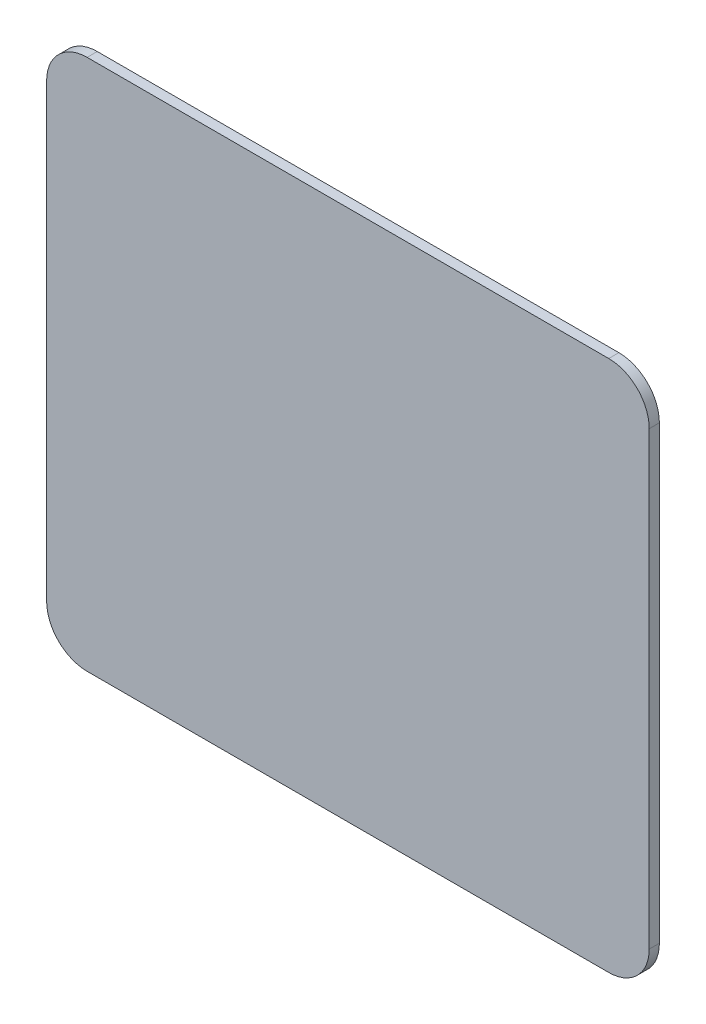
ISO-10303-21;
HEADER;
FILE_DESCRIPTION(('STEP AP214'),'2;1');
FILE_NAME('part.step','',(''),(''),'','','');
FILE_SCHEMA(('AUTOMOTIVE_DESIGN { 1 0 10303 214 1 1 1 1 }'));
ENDSEC;
DATA;
#1=APPLICATION_CONTEXT('core data for automotive mechanical design processes');
#2=APPLICATION_PROTOCOL_DEFINITION('international standard','automotive_design',2000,#1);
#3=PRODUCT_CONTEXT('',#1,'mechanical');
#4=PRODUCT('Part','Part','',(#3));
#5=PRODUCT_RELATED_PRODUCT_CATEGORY('part','',(#4));
#6=PRODUCT_DEFINITION_FORMATION('','',#4);
#7=PRODUCT_DEFINITION_CONTEXT('part definition',#1,'design');
#8=PRODUCT_DEFINITION('design','',#6,#7);
#9=PRODUCT_DEFINITION_SHAPE('','',#8);
#10=(LENGTH_UNIT() NAMED_UNIT(*) SI_UNIT(.MILLI.,.METRE.));
#11=(NAMED_UNIT(*) PLANE_ANGLE_UNIT() SI_UNIT($,.RADIAN.));
#12=(NAMED_UNIT(*) SI_UNIT($,.STERADIAN.) SOLID_ANGLE_UNIT());
#13=UNCERTAINTY_MEASURE_WITH_UNIT(LENGTH_MEASURE(1.E-05),#10,'distance_accuracy_value','');
#14=(GEOMETRIC_REPRESENTATION_CONTEXT(3) GLOBAL_UNCERTAINTY_ASSIGNED_CONTEXT((#13)) GLOBAL_UNIT_ASSIGNED_CONTEXT((#10,
#11,#12)) REPRESENTATION_CONTEXT('',''));
#15=CARTESIAN_POINT('',(0.,0.,0.));
#16=DIRECTION('',(0.,0.,1.));
#17=DIRECTION('',(1.,0.,0.));
#18=AXIS2_PLACEMENT_3D('',#15,#16,#17);
#19=CARTESIAN_POINT('',(0.,0.,6.35));
#20=DIRECTION('',(1.,0.,0.));
#21=DIRECTION('',(0.,0.,-1.));
#22=AXIS2_PLACEMENT_3D('',#19,#20,#21);
#23=PLANE('',#22);
#24=DIRECTION('',(0.,-1.,0.));
#25=VECTOR('',#24,1.);
#26=CARTESIAN_POINT('',(0.,0.,6.35));
#27=LINE('',#26,#25);
#28=CARTESIAN_POINT('',(0.,-25.4,6.35));
#29=VERTEX_POINT('',#28);
#30=CARTESIAN_POINT('',(0.,-308.102,6.35));
#31=VERTEX_POINT('',#30);
#32=EDGE_CURVE('E113',#29,#31,#27,.T.);
#33=ORIENTED_EDGE('',*,*,#32,.F.);
#34=DIRECTION('',(0.,0.,-1.));
#35=VECTOR('',#34,1.);
#36=CARTESIAN_POINT('',(0.,-25.4,6.35));
#37=LINE('',#36,#35);
#38=CARTESIAN_POINT('',(0.,-25.4,0.));
#39=VERTEX_POINT('',#38);
#40=EDGE_CURVE('E147',#29,#39,#37,.T.);
#41=ORIENTED_EDGE('',*,*,#40,.T.);
#42=DIRECTION('',(0.,-1.,0.));
#43=VECTOR('',#42,1.);
#44=CARTESIAN_POINT('',(0.,0.,0.));
#45=LINE('',#44,#43);
#46=CARTESIAN_POINT('',(0.,-308.102,0.));
#47=VERTEX_POINT('',#46);
#48=EDGE_CURVE('E153',#39,#47,#45,.T.);
#49=ORIENTED_EDGE('',*,*,#48,.T.);
#50=DIRECTION('',(0.,0.,-1.));
#51=VECTOR('',#50,1.);
#52=CARTESIAN_POINT('',(0.,-308.102,6.35));
#53=LINE('',#52,#51);
#54=EDGE_CURVE('E142',#47,#31,#53,.F.);
#55=ORIENTED_EDGE('',*,*,#54,.T.);
#56=EDGE_LOOP('',(#33,#41,#49,#55));
#57=FACE_BOUND('',#56,.T.);
#58=ADVANCED_FACE('F33',(#57),#23,.F.);
#59=CARTESIAN_POINT('',(0.,-333.502,6.35));
#60=DIRECTION('',(0.,1.,0.));
#61=DIRECTION('',(0.,0.,1.));
#62=AXIS2_PLACEMENT_3D('',#59,#60,#61);
#63=PLANE('',#62);
#64=DIRECTION('',(1.,0.,0.));
#65=VECTOR('',#64,1.);
#66=CARTESIAN_POINT('',(0.,-333.502,6.35));
#67=LINE('',#66,#65);
#68=CARTESIAN_POINT('',(25.4,-333.502,6.35));
#69=VERTEX_POINT('',#68);
#70=CARTESIAN_POINT('',(352.552,-333.502,6.35));
#71=VERTEX_POINT('',#70);
#72=EDGE_CURVE('E116',#69,#71,#67,.T.);
#73=ORIENTED_EDGE('',*,*,#72,.F.);
#74=DIRECTION('',(0.,0.,-1.));
#75=VECTOR('',#74,1.);
#76=CARTESIAN_POINT('',(25.4,-333.502,6.35));
#77=LINE('',#76,#75);
#78=CARTESIAN_POINT('',(25.4,-333.502,0.));
#79=VERTEX_POINT('',#78);
#80=EDGE_CURVE('E136',#69,#79,#77,.T.);
#81=ORIENTED_EDGE('',*,*,#80,.T.);
#82=DIRECTION('',(1.,0.,0.));
#83=VECTOR('',#82,1.);
#84=CARTESIAN_POINT('',(0.,-333.502,0.));
#85=LINE('',#84,#83);
#86=CARTESIAN_POINT('',(352.552,-333.502,0.));
#87=VERTEX_POINT('',#86);
#88=EDGE_CURVE('E118',#79,#87,#85,.T.);
#89=ORIENTED_EDGE('',*,*,#88,.T.);
#90=DIRECTION('',(0.,0.,-1.));
#91=VECTOR('',#90,1.);
#92=CARTESIAN_POINT('',(352.552,-333.502,6.35));
#93=LINE('',#92,#91);
#94=EDGE_CURVE('E131',#87,#71,#93,.F.);
#95=ORIENTED_EDGE('',*,*,#94,.T.);
#96=EDGE_LOOP('',(#73,#81,#89,#95));
#97=FACE_BOUND('',#96,.T.);
#98=ADVANCED_FACE('F172',(#97),#63,.F.);
#99=CARTESIAN_POINT('',(377.952,0.,6.35));
#100=DIRECTION('',(-1.,0.,0.));
#101=DIRECTION('',(0.,-1.,0.));
#102=AXIS2_PLACEMENT_3D('',#99,#100,#101);
#103=PLANE('',#102);
#104=DIRECTION('',(0.,1.,0.));
#105=VECTOR('',#104,1.);
#106=CARTESIAN_POINT('',(377.952,0.,6.35));
#107=LINE('',#106,#105);
#108=CARTESIAN_POINT('',(377.952,-308.102,6.35));
#109=VERTEX_POINT('',#108);
#110=CARTESIAN_POINT('',(377.952,-25.4,6.35));
#111=VERTEX_POINT('',#110);
#112=EDGE_CURVE('E161',#109,#111,#107,.T.);
#113=ORIENTED_EDGE('',*,*,#112,.F.);
#114=DIRECTION('',(0.,0.,-1.));
#115=VECTOR('',#114,1.);
#116=CARTESIAN_POINT('',(377.952,-308.102,6.35));
#117=LINE('',#116,#115);
#118=CARTESIAN_POINT('',(377.952,-308.102,0.));
#119=VERTEX_POINT('',#118);
#120=EDGE_CURVE('E125',#109,#119,#117,.T.);
#121=ORIENTED_EDGE('',*,*,#120,.T.);
#122=DIRECTION('',(0.,1.,0.));
#123=VECTOR('',#122,1.);
#124=CARTESIAN_POINT('',(377.952,0.,0.));
#125=LINE('',#124,#123);
#126=CARTESIAN_POINT('',(377.952,-25.4,0.));
#127=VERTEX_POINT('',#126);
#128=EDGE_CURVE('E114',#119,#127,#125,.T.);
#129=ORIENTED_EDGE('',*,*,#128,.T.);
#130=DIRECTION('',(0.,0.,-1.));
#131=VECTOR('',#130,1.);
#132=CARTESIAN_POINT('',(377.952,-25.4,6.35));
#133=LINE('',#132,#131);
#134=EDGE_CURVE('E105',#127,#111,#133,.F.);
#135=ORIENTED_EDGE('',*,*,#134,.T.);
#136=EDGE_LOOP('',(#113,#121,#129,#135));
#137=FACE_BOUND('',#136,.T.);
#138=ADVANCED_FACE('F177',(#137),#103,.F.);
#139=CARTESIAN_POINT('',(0.,0.,6.35));
#140=DIRECTION('',(0.,-1.,0.));
#141=DIRECTION('',(0.,0.,-1.));
#142=AXIS2_PLACEMENT_3D('',#139,#140,#141);
#143=PLANE('',#142);
#144=DIRECTION('',(-1.,0.,0.));
#145=VECTOR('',#144,1.);
#146=CARTESIAN_POINT('',(0.,0.,0.));
#147=LINE('',#146,#145);
#148=CARTESIAN_POINT('',(352.552,0.,0.));
#149=VERTEX_POINT('',#148);
#150=CARTESIAN_POINT('',(25.4,0.,0.));
#151=VERTEX_POINT('',#150);
#152=EDGE_CURVE('E109',#149,#151,#147,.T.);
#153=ORIENTED_EDGE('',*,*,#152,.T.);
#154=DIRECTION('',(0.,0.,-1.));
#155=VECTOR('',#154,1.);
#156=CARTESIAN_POINT('',(25.4,0.,6.35));
#157=LINE('',#156,#155);
#158=CARTESIAN_POINT('',(25.4,0.,6.35));
#159=VERTEX_POINT('',#158);
#160=EDGE_CURVE('E41',#151,#159,#157,.F.);
#161=ORIENTED_EDGE('',*,*,#160,.T.);
#162=DIRECTION('',(-1.,0.,0.));
#163=VECTOR('',#162,1.);
#164=CARTESIAN_POINT('',(0.,0.,6.35));
#165=LINE('',#164,#163);
#166=CARTESIAN_POINT('',(352.552,0.,6.35));
#167=VERTEX_POINT('',#166);
#168=EDGE_CURVE('E110',#167,#159,#165,.T.);
#169=ORIENTED_EDGE('',*,*,#168,.F.);
#170=DIRECTION('',(0.,0.,-1.));
#171=VECTOR('',#170,1.);
#172=CARTESIAN_POINT('',(352.552,0.,6.35));
#173=LINE('',#172,#171);
#174=EDGE_CURVE('E103',#167,#149,#173,.T.);
#175=ORIENTED_EDGE('',*,*,#174,.T.);
#176=EDGE_LOOP('',(#153,#161,#169,#175));
#177=FACE_BOUND('',#176,.T.);
#178=ADVANCED_FACE('F108',(#177),#143,.F.);
#179=CARTESIAN_POINT('',(0.,0.,6.35));
#180=DIRECTION('',(0.,0.,1.));
#181=DIRECTION('',(1.,0.,0.));
#182=AXIS2_PLACEMENT_3D('',#179,#180,#181);
#183=PLANE('',#182);
#184=ORIENTED_EDGE('',*,*,#168,.T.);
#185=CARTESIAN_POINT('',(25.4,-25.4,6.35));
#186=DIRECTION('',(0.,0.,1.));
#187=DIRECTION('',(1.,0.,0.));
#188=AXIS2_PLACEMENT_3D('',#185,#186,#187);
#189=CIRCLE('',#188,25.4);
#190=EDGE_CURVE('E11',#159,#29,#189,.T.);
#191=ORIENTED_EDGE('',*,*,#190,.T.);
#192=ORIENTED_EDGE('',*,*,#32,.T.);
#193=CARTESIAN_POINT('',(25.4,-308.102,6.35));
#194=DIRECTION('',(0.,0.,1.));
#195=DIRECTION('',(1.,0.,0.));
#196=AXIS2_PLACEMENT_3D('',#193,#194,#195);
#197=CIRCLE('',#196,25.4);
#198=EDGE_CURVE('E145',#31,#69,#197,.T.);
#199=ORIENTED_EDGE('',*,*,#198,.T.);
#200=ORIENTED_EDGE('',*,*,#72,.T.);
#201=CARTESIAN_POINT('',(352.552,-308.102,6.35));
#202=DIRECTION('',(0.,0.,1.));
#203=DIRECTION('',(1.,0.,0.));
#204=AXIS2_PLACEMENT_3D('',#201,#202,#203);
#205=CIRCLE('',#204,25.4);
#206=EDGE_CURVE('E134',#71,#109,#205,.T.);
#207=ORIENTED_EDGE('',*,*,#206,.T.);
#208=ORIENTED_EDGE('',*,*,#112,.T.);
#209=CARTESIAN_POINT('',(352.552,-25.4,6.35));
#210=DIRECTION('',(0.,0.,1.));
#211=DIRECTION('',(1.,0.,0.));
#212=AXIS2_PLACEMENT_3D('',#209,#210,#211);
#213=CIRCLE('',#212,25.4);
#214=EDGE_CURVE('E123',#111,#167,#213,.T.);
#215=ORIENTED_EDGE('',*,*,#214,.T.);
#216=EDGE_LOOP('',(#184,#191,#192,#199,#200,#207,#208,#215));
#217=FACE_BOUND('',#216,.T.);
#218=ADVANCED_FACE('F165',(#217),#183,.T.);
#219=CARTESIAN_POINT('',(0.,0.,0.));
#220=DIRECTION('',(0.,0.,1.));
#221=DIRECTION('',(1.,0.,0.));
#222=AXIS2_PLACEMENT_3D('',#219,#220,#221);
#223=PLANE('',#222);
#224=ORIENTED_EDGE('',*,*,#48,.F.);
#225=CARTESIAN_POINT('',(25.4,-25.4,0.));
#226=DIRECTION('',(0.,0.,1.));
#227=DIRECTION('',(1.,0.,0.));
#228=AXIS2_PLACEMENT_3D('',#225,#226,#227);
#229=CIRCLE('',#228,25.4);
#230=EDGE_CURVE('E55',#39,#151,#229,.F.);
#231=ORIENTED_EDGE('',*,*,#230,.T.);
#232=ORIENTED_EDGE('',*,*,#152,.F.);
#233=CARTESIAN_POINT('',(352.552,-25.4,0.));
#234=DIRECTION('',(0.,0.,1.));
#235=DIRECTION('',(1.,0.,0.));
#236=AXIS2_PLACEMENT_3D('',#233,#234,#235);
#237=CIRCLE('',#236,25.4);
#238=EDGE_CURVE('E99',#149,#127,#237,.F.);
#239=ORIENTED_EDGE('',*,*,#238,.T.);
#240=ORIENTED_EDGE('',*,*,#128,.F.);
#241=CARTESIAN_POINT('',(352.552,-308.102,0.));
#242=DIRECTION('',(0.,0.,1.));
#243=DIRECTION('',(1.,0.,0.));
#244=AXIS2_PLACEMENT_3D('',#241,#242,#243);
#245=CIRCLE('',#244,25.4);
#246=EDGE_CURVE('E128',#119,#87,#245,.F.);
#247=ORIENTED_EDGE('',*,*,#246,.T.);
#248=ORIENTED_EDGE('',*,*,#88,.F.);
#249=CARTESIAN_POINT('',(25.4,-308.102,0.));
#250=DIRECTION('',(0.,0.,1.));
#251=DIRECTION('',(1.,0.,0.));
#252=AXIS2_PLACEMENT_3D('',#249,#250,#251);
#253=CIRCLE('',#252,25.4);
#254=EDGE_CURVE('E139',#79,#47,#253,.F.);
#255=ORIENTED_EDGE('',*,*,#254,.T.);
#256=EDGE_LOOP('',(#224,#231,#232,#239,#240,#247,#248,#255));
#257=FACE_BOUND('',#256,.T.);
#258=ADVANCED_FACE('F112',(#257),#223,.F.);
#259=CARTESIAN_POINT('',(352.552,-25.4,6.35));
#260=DIRECTION('',(0.,0.,-1.));
#261=DIRECTION('',(-1.,0.,0.));
#262=AXIS2_PLACEMENT_3D('',#259,#260,#261);
#263=CYLINDRICAL_SURFACE('',#262,25.4);
#264=ORIENTED_EDGE('',*,*,#214,.F.);
#265=ORIENTED_EDGE('',*,*,#134,.F.);
#266=ORIENTED_EDGE('',*,*,#238,.F.);
#267=ORIENTED_EDGE('',*,*,#174,.F.);
#268=EDGE_LOOP('',(#264,#265,#266,#267));
#269=FACE_BOUND('',#268,.T.);
#270=ADVANCED_FACE('F102',(#269),#263,.T.);
#271=CARTESIAN_POINT('',(352.552,-308.102,6.35));
#272=DIRECTION('',(0.,0.,-1.));
#273=DIRECTION('',(-1.,0.,0.));
#274=AXIS2_PLACEMENT_3D('',#271,#272,#273);
#275=CYLINDRICAL_SURFACE('',#274,25.4);
#276=ORIENTED_EDGE('',*,*,#206,.F.);
#277=ORIENTED_EDGE('',*,*,#94,.F.);
#278=ORIENTED_EDGE('',*,*,#246,.F.);
#279=ORIENTED_EDGE('',*,*,#120,.F.);
#280=EDGE_LOOP('',(#276,#277,#278,#279));
#281=FACE_BOUND('',#280,.T.);
#282=ADVANCED_FACE('F175',(#281),#275,.T.);
#283=CARTESIAN_POINT('',(25.4,-308.102,6.35));
#284=DIRECTION('',(0.,0.,-1.));
#285=DIRECTION('',(-1.,0.,0.));
#286=AXIS2_PLACEMENT_3D('',#283,#284,#285);
#287=CYLINDRICAL_SURFACE('',#286,25.4);
#288=ORIENTED_EDGE('',*,*,#198,.F.);
#289=ORIENTED_EDGE('',*,*,#54,.F.);
#290=ORIENTED_EDGE('',*,*,#254,.F.);
#291=ORIENTED_EDGE('',*,*,#80,.F.);
#292=EDGE_LOOP('',(#288,#289,#290,#291));
#293=FACE_BOUND('',#292,.T.);
#294=ADVANCED_FACE('F179',(#293),#287,.T.);
#295=CARTESIAN_POINT('',(25.4,-25.4,6.35));
#296=DIRECTION('',(0.,0.,-1.));
#297=DIRECTION('',(-1.,0.,0.));
#298=AXIS2_PLACEMENT_3D('',#295,#296,#297);
#299=CYLINDRICAL_SURFACE('',#298,25.4);
#300=ORIENTED_EDGE('',*,*,#190,.F.);
#301=ORIENTED_EDGE('',*,*,#160,.F.);
#302=ORIENTED_EDGE('',*,*,#230,.F.);
#303=ORIENTED_EDGE('',*,*,#40,.F.);
#304=EDGE_LOOP('',(#300,#301,#302,#303));
#305=FACE_BOUND('',#304,.T.);
#306=ADVANCED_FACE('F35',(#305),#299,.T.);
#307=CLOSED_SHELL('',(#58,#98,#138,#178,#218,#258,#270,#282,#294,#306));
#308=MANIFOLD_SOLID_BREP('B2',#307);
#309=ADVANCED_BREP_SHAPE_REPRESENTATION('',(#18,#308),#14);
#310=SHAPE_DEFINITION_REPRESENTATION(#9,#309);
ENDSEC;
END-ISO-10303-21;
